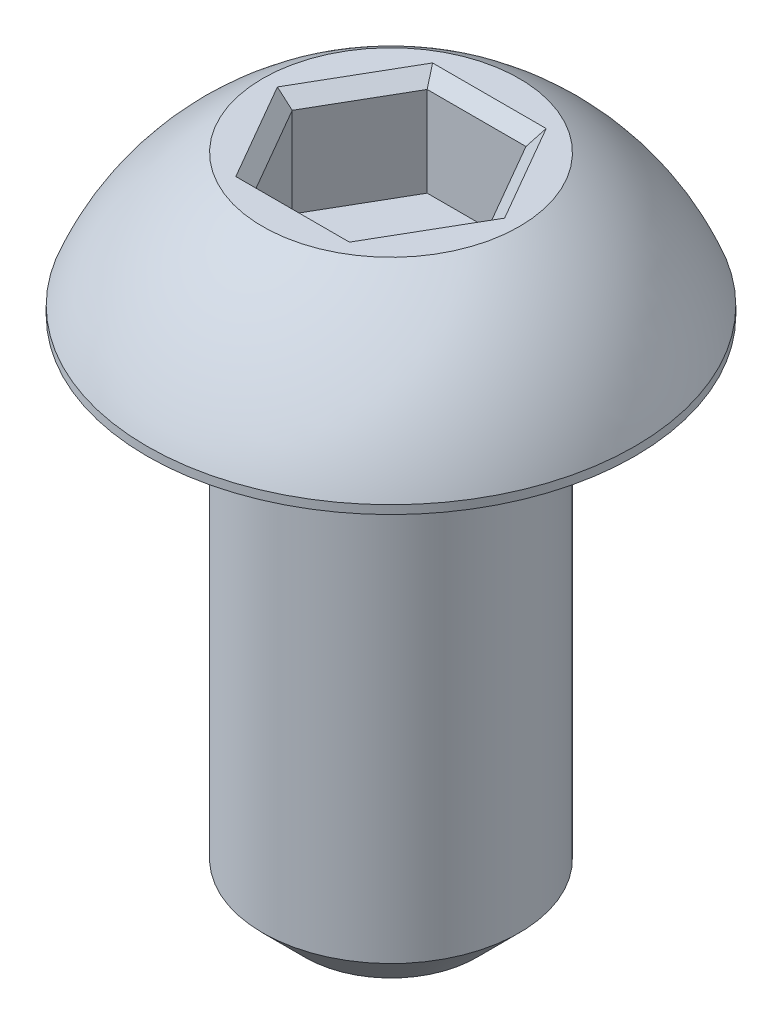
ISO-10303-21;
HEADER;
FILE_DESCRIPTION(('STEP AP214'),'2;1');
FILE_NAME('part.step','',(''),(''),'','','');
FILE_SCHEMA(('AUTOMOTIVE_DESIGN { 1 0 10303 214 1 1 1 1 }'));
ENDSEC;
DATA;
#1=APPLICATION_CONTEXT('core data for automotive mechanical design processes');
#2=APPLICATION_PROTOCOL_DEFINITION('international standard','automotive_design',2000,#1);
#3=PRODUCT_CONTEXT('',#1,'mechanical');
#4=PRODUCT('Part','Part','',(#3));
#5=PRODUCT_RELATED_PRODUCT_CATEGORY('part','',(#4));
#6=PRODUCT_DEFINITION_FORMATION('','',#4);
#7=PRODUCT_DEFINITION_CONTEXT('part definition',#1,'design');
#8=PRODUCT_DEFINITION('design','',#6,#7);
#9=PRODUCT_DEFINITION_SHAPE('','',#8);
#10=(LENGTH_UNIT() NAMED_UNIT(*) SI_UNIT(.MILLI.,.METRE.));
#11=(NAMED_UNIT(*) PLANE_ANGLE_UNIT() SI_UNIT($,.RADIAN.));
#12=(NAMED_UNIT(*) SI_UNIT($,.STERADIAN.) SOLID_ANGLE_UNIT());
#13=UNCERTAINTY_MEASURE_WITH_UNIT(LENGTH_MEASURE(1.E-05),#10,'distance_accuracy_value','');
#14=(GEOMETRIC_REPRESENTATION_CONTEXT(3) GLOBAL_UNCERTAINTY_ASSIGNED_CONTEXT((#13)) GLOBAL_UNIT_ASSIGNED_CONTEXT((#10,
#11,#12)) REPRESENTATION_CONTEXT('',''));
#15=CARTESIAN_POINT('',(0.,0.,0.));
#16=DIRECTION('',(0.,0.,1.));
#17=DIRECTION('',(1.,0.,0.));
#18=AXIS2_PLACEMENT_3D('',#15,#16,#17);
#19=CARTESIAN_POINT('',(0.,1.65,0.));
#20=DIRECTION('',(0.,-1.,0.));
#21=DIRECTION('',(0.,0.,-1.));
#22=AXIS2_PLACEMENT_3D('',#19,#20,#21);
#23=PLANE('',#22);
#24=DIRECTION('',(-0.5,0.,-0.866025403784439));
#25=VECTOR('',#24,1.);
#26=CARTESIAN_POINT('',(-0.995929214352105,1.65,0.575000000000002));
#27=LINE('',#26,#25);
#28=CARTESIAN_POINT('',(-0.663952809568065,1.65,1.15000000000001));
#29=VERTEX_POINT('',#28);
#30=CARTESIAN_POINT('',(-1.32790561913613,1.65,0.));
#31=VERTEX_POINT('',#30);
#32=EDGE_CURVE('E180',#29,#31,#27,.T.);
#33=ORIENTED_EDGE('',*,*,#32,.T.);
#34=DIRECTION('',(0.5,0.,-0.866025403784439));
#35=VECTOR('',#34,1.);
#36=CARTESIAN_POINT('',(-0.995929214352095,1.65,-0.574999999999996));
#37=LINE('',#36,#35);
#38=CARTESIAN_POINT('',(-0.663952809568065,1.65,-1.14999999999999));
#39=VERTEX_POINT('',#38);
#40=EDGE_CURVE('E182',#31,#39,#37,.T.);
#41=ORIENTED_EDGE('',*,*,#40,.T.);
#42=DIRECTION('',(1.,0.,0.));
#43=VECTOR('',#42,1.);
#44=CARTESIAN_POINT('',(0.,1.65,-1.14999999999999));
#45=LINE('',#44,#43);
#46=CARTESIAN_POINT('',(0.663952809568073,1.65,-1.14999999999999));
#47=VERTEX_POINT('',#46);
#48=EDGE_CURVE('E172',#39,#47,#45,.T.);
#49=ORIENTED_EDGE('',*,*,#48,.T.);
#50=DIRECTION('',(0.5,0.,0.866025403784439));
#51=VECTOR('',#50,1.);
#52=CARTESIAN_POINT('',(0.995929214352102,1.65,-0.574999999999998));
#53=LINE('',#52,#51);
#54=CARTESIAN_POINT('',(1.32790561913614,1.65,0.));
#55=VERTEX_POINT('',#54);
#56=EDGE_CURVE('E174',#47,#55,#53,.T.);
#57=ORIENTED_EDGE('',*,*,#56,.T.);
#58=DIRECTION('',(-0.5,0.,0.866025403784439));
#59=VECTOR('',#58,1.);
#60=CARTESIAN_POINT('',(0.995929214352113,1.65,0.575000000000003));
#61=LINE('',#60,#59);
#62=CARTESIAN_POINT('',(0.663952809568073,1.65,1.15000000000001));
#63=VERTEX_POINT('',#62);
#64=EDGE_CURVE('E176',#55,#63,#61,.T.);
#65=ORIENTED_EDGE('',*,*,#64,.T.);
#66=DIRECTION('',(-1.,0.,0.));
#67=VECTOR('',#66,1.);
#68=CARTESIAN_POINT('',(0.,1.65,1.15000000000001));
#69=LINE('',#68,#67);
#70=EDGE_CURVE('E178',#63,#29,#69,.T.);
#71=ORIENTED_EDGE('',*,*,#70,.T.);
#72=EDGE_LOOP('',(#33,#41,#49,#57,#65,#71));
#73=FACE_BOUND('',#72,.T.);
#74=CARTESIAN_POINT('',(0.,1.65,0.));
#75=DIRECTION('',(0.,1.,0.));
#76=DIRECTION('',(0.,0.,1.));
#77=AXIS2_PLACEMENT_3D('',#74,#75,#76);
#78=CIRCLE('',#77,1.5);
#79=CARTESIAN_POINT('',(1.5,1.65,0.));
#80=VERTEX_POINT('',#79);
#81=EDGE_CURVE('E168',#80,#80,#78,.T.);
#82=ORIENTED_EDGE('',*,*,#81,.T.);
#83=EDGE_LOOP('',(#82));
#84=FACE_BOUND('',#83,.T.);
#85=ADVANCED_FACE('F35',(#73,#84),#23,.F.);
#86=CARTESIAN_POINT('',(0.,-1.01935483870968,0.));
#87=DIRECTION('',(0.,1.,0.));
#88=DIRECTION('',(1.,0.,0.));
#89=AXIS2_PLACEMENT_3D('',#86,#87,#88);
#90=SPHERICAL_SURFACE('',#89,3.06193652039731);
#91=CARTESIAN_POINT('',(0.,0.1,0.));
#92=DIRECTION('',(0.,1.,0.));
#93=DIRECTION('',(0.,0.,1.));
#94=AXIS2_PLACEMENT_3D('',#91,#92,#93);
#95=CIRCLE('',#94,2.85);
#96=CARTESIAN_POINT('',(2.85,0.1,0.));
#97=VERTEX_POINT('',#96);
#98=EDGE_CURVE('E165',#97,#97,#95,.T.);
#99=CARTESIAN_POINT('',(1.5,1.65,0.));
#100=CARTESIAN_POINT('',(1.51903561196716,1.639303295306,0.));
#101=CARTESIAN_POINT('',(1.53795676556563,1.62840290684862,0.));
#102=CARTESIAN_POINT('',(1.57556158222851,1.6061998963006,0.));
#103=CARTESIAN_POINT('',(1.59424524529291,1.59489727420996,0.));
#104=CARTESIAN_POINT('',(1.63136650709099,1.57189493028889,0.));
#105=CARTESIAN_POINT('',(1.64980410582466,1.56019520845846,0.));
#106=CARTESIAN_POINT('',(1.68642480690278,1.53640403001542,0.));
#107=CARTESIAN_POINT('',(1.70460790924724,1.52431257340281,0.));
#108=CARTESIAN_POINT('',(1.7407112941585,1.49974345641876,0.));
#109=CARTESIAN_POINT('',(1.7586315767253,1.48726579604732,0.));
#110=CARTESIAN_POINT('',(1.79420112106677,1.46192998286172,0.));
#111=CARTESIAN_POINT('',(1.81185038284143,1.44907183004756,0.));
#112=CARTESIAN_POINT('',(1.84686980806014,1.42298091648115,0.));
#113=CARTESIAN_POINT('',(1.86423997150418,1.40974815572889,0.));
#114=CARTESIAN_POINT('',(1.89869325040636,1.38291408248949,0.));
#115=CARTESIAN_POINT('',(1.9157763658645,1.36931277000235,0.));
#116=CARTESIAN_POINT('',(1.9496477304707,1.34174781810087,0.));
#117=CARTESIAN_POINT('',(1.96643597961876,1.32778417868653,0.));
#118=CARTESIAN_POINT('',(1.99970992824093,1.29950096358037,0.));
#119=CARTESIAN_POINT('',(2.01619562771503,1.28518138788854,0.));
#120=CARTESIAN_POINT('',(2.04885693208838,1.2561928537712,0.));
#121=CARTESIAN_POINT('',(2.06503253698763,1.24152389534568,0.));
#122=CARTESIAN_POINT('',(2.09706624923009,1.21184330920572,0.));
#123=CARTESIAN_POINT('',(2.1129243565733,1.19683168149128,0.));
#124=CARTESIAN_POINT('',(2.14431581602928,1.16647262704509,0.));
#125=CARTESIAN_POINT('',(2.15984916814205,1.15112520031333,0.));
#126=CARTESIAN_POINT('',(2.19058400809134,1.12010157178707,0.));
#127=CARTESIAN_POINT('',(2.20578549592787,1.10442536999258,0.));
#128=CARTESIAN_POINT('',(2.23584965016101,1.07275136576372,0.));
#129=CARTESIAN_POINT('',(2.25071231655761,1.05675356332935,0.));
#130=CARTESIAN_POINT('',(2.28009202581336,1.02444367942842,0.));
#131=CARTESIAN_POINT('',(2.29460906867251,1.00813159796187,0.));
#132=CARTESIAN_POINT('',(2.32329088693502,0.975200621438238,0.));
#133=CARTESIAN_POINT('',(2.33745566233839,0.958581726381168,0.));
#134=CARTESIAN_POINT('',(2.36542646299095,0.925044728535524,0.));
#135=CARTESIAN_POINT('',(2.37923248824013,0.908126625746949,0.));
#136=CARTESIAN_POINT('',(2.40647947007269,0.873998955233716,0.));
#137=CARTESIAN_POINT('',(2.41992042665607,0.856789387509057,0.));
#138=CARTESIAN_POINT('',(2.44643111972394,0.822086663311891,0.));
#139=CARTESIAN_POINT('',(2.45950085620844,0.804593506839383,0.));
#140=CARTESIAN_POINT('',(2.4852631275393,0.769331611122919,0.));
#141=CARTESIAN_POINT('',(2.49795566238565,0.751562871878962,0.));
#142=CARTESIAN_POINT('',(2.52295772153242,0.715757942720172,0.));
#143=CARTESIAN_POINT('',(2.53526724583283,0.697721752805339,0.));
#144=CARTESIAN_POINT('',(2.55949765026941,0.661390176807579,0.));
#145=CARTESIAN_POINT('',(2.57141853040558,0.643094790724652,0.));
#146=CARTESIAN_POINT('',(2.59486619076497,0.606253195518658,0.));
#147=CARTESIAN_POINT('',(2.6063929709882,0.58770698639559,0.));
#148=CARTESIAN_POINT('',(2.62904715613284,0.550372233027588,0.));
#149=CARTESIAN_POINT('',(2.64017456105425,0.531583688782654,0.));
#150=CARTESIAN_POINT('',(2.6620249030054,0.493772864005264,0.));
#151=CARTESIAN_POINT('',(2.67274784003514,0.474750583472809,0.));
#152=CARTESIAN_POINT('',(2.6937843386502,0.43648099189676,0.));
#153=CARTESIAN_POINT('',(2.70409790023551,0.417233680853167,0.));
#154=CARTESIAN_POINT('',(2.72431092803757,0.37852283713324,0.));
#155=CARTESIAN_POINT('',(2.73421039425431,0.359059304456906,0.));
#156=CARTESIAN_POINT('',(2.75359069989448,0.319924924881905,0.));
#157=CARTESIAN_POINT('',(2.76307153931791,0.300254077983239,0.));
#158=CARTESIAN_POINT('',(2.78161025533183,0.260714073839118,0.));
#159=CARTESIAN_POINT('',(2.79066813192231,0.240844916593663,0.));
#160=CARTESIAN_POINT('',(2.80835676564226,0.200917380475518,0.));
#161=CARTESIAN_POINT('',(2.81698752277173,0.180859001602827,0.));
#162=CARTESIAN_POINT('',(2.83381800927563,0.140562219626024,0.));
#163=CARTESIAN_POINT('',(2.84201773865007,0.120323816521913,0.));
#164=CARTESIAN_POINT('',(2.85,0.1,0.));
#165=B_SPLINE_CURVE_WITH_KNOTS('',3,(#99,#100,#101,#102,#103,#104,#105,#106,#107,#108,#109,#110,
#111,#112,#113,#114,#115,#116,#117,#118,#119,#120,#121,#122,#123,#124,#125,#126,#127,#128,#129,
#130,#131,#132,#133,#134,#135,#136,#137,#138,#139,#140,#141,#142,#143,#144,#145,#146,#147,#148,
#149,#150,#151,#152,#153,#154,#155,#156,#157,#158,#159,#160,#161,#162,#163,#164),.UNSPECIFIED.,
.F.,.F.,(4,2,2,2,2,2,2,2,2,2,2,2,2,2,2,2,2,2,2,2,2,2,2,2,2,2,2,2,2,2,2,2,4),(0.,
0.0655042148297505,0.131008429659501,0.196512644489251,0.262016859319002,0.327521074148752,
0.393025288978502,0.458529503808253,0.524033718638003,0.589537933467754,0.655042148297504,
0.720546363127254,0.786050577957005,0.851554792786755,0.917059007616505,0.982563222446256,
1.04806743727601,1.11357165210576,1.17907586693551,1.24458008176526,1.31008429659501,
1.37558851142476,1.44109272625451,1.50659694108426,1.57210115591401,1.63760537074376,
1.70310958557351,1.76861380040326,1.83411801523301,1.89962223006276,1.96512644489251,
2.03063065972226,2.09613487455201),.UNSPECIFIED.);
#166=EDGE_CURVE('BSEAM236',#80,#97,#165,.T.);
#167=ORIENTED_EDGE('',*,*,#81,.F.);
#168=ORIENTED_EDGE('',*,*,#98,.T.);
#169=ORIENTED_EDGE('',*,*,#166,.T.);
#170=ORIENTED_EDGE('',*,*,#166,.F.);
#171=EDGE_LOOP('',(#167,#169,#168,#170));
#172=FACE_BOUND('',#171,.T.);
#173=ADVANCED_FACE('F236',(#172),#90,.T.);
#174=CARTESIAN_POINT('',(0.,6.97297297297297,0.));
#175=DIRECTION('',(0.,1.,0.));
#176=DIRECTION('',(0.,0.,1.));
#177=AXIS2_PLACEMENT_3D('',#174,#175,#176);
#178=CYLINDRICAL_SURFACE('',#177,2.85);
#179=ORIENTED_EDGE('',*,*,#98,.F.);
#180=EDGE_LOOP('',(#179));
#181=FACE_BOUND('',#180,.T.);
#182=CARTESIAN_POINT('',(0.,0.,0.));
#183=DIRECTION('',(0.,1.,0.));
#184=DIRECTION('',(0.,0.,1.));
#185=AXIS2_PLACEMENT_3D('',#182,#183,#184);
#186=CIRCLE('',#185,2.85);
#187=CARTESIAN_POINT('',(0.,0.,2.85));
#188=VERTEX_POINT('',#187);
#189=EDGE_CURVE('E162',#188,#188,#186,.T.);
#190=ORIENTED_EDGE('',*,*,#189,.T.);
#191=EDGE_LOOP('',(#190));
#192=FACE_BOUND('',#191,.T.);
#193=ADVANCED_FACE('F242',(#181,#192),#178,.T.);
#194=CARTESIAN_POINT('',(2.85,0.,0.));
#195=DIRECTION('',(0.,1.,0.));
#196=DIRECTION('',(0.,0.,1.));
#197=AXIS2_PLACEMENT_3D('',#194,#195,#196);
#198=PLANE('',#197);
#199=ORIENTED_EDGE('',*,*,#189,.F.);
#200=EDGE_LOOP('',(#199));
#201=FACE_BOUND('',#200,.T.);
#202=CARTESIAN_POINT('',(0.,0.,0.));
#203=DIRECTION('',(0.,1.,0.));
#204=DIRECTION('',(0.,0.,1.));
#205=AXIS2_PLACEMENT_3D('',#202,#203,#204);
#206=CIRCLE('',#205,1.5);
#207=CARTESIAN_POINT('',(0.,0.,1.5));
#208=VERTEX_POINT('',#207);
#209=EDGE_CURVE('E159',#208,#208,#206,.T.);
#210=ORIENTED_EDGE('',*,*,#209,.T.);
#211=EDGE_LOOP('',(#210));
#212=FACE_BOUND('',#211,.T.);
#213=ADVANCED_FACE('F372',(#201,#212),#198,.F.);
#214=CARTESIAN_POINT('',(0.,6.97297297297297,0.));
#215=DIRECTION('',(0.,1.,0.));
#216=DIRECTION('',(0.,0.,1.));
#217=AXIS2_PLACEMENT_3D('',#214,#215,#216);
#218=CYLINDRICAL_SURFACE('',#217,1.5);
#219=ORIENTED_EDGE('',*,*,#209,.F.);
#220=EDGE_LOOP('',(#219));
#221=FACE_BOUND('',#220,.T.);
#222=CARTESIAN_POINT('',(0.,-5.5,0.));
#223=DIRECTION('',(0.,1.,0.));
#224=DIRECTION('',(0.,0.,1.));
#225=AXIS2_PLACEMENT_3D('',#222,#223,#224);
#226=CIRCLE('',#225,1.5);
#227=CARTESIAN_POINT('',(0.,-5.5,1.5));
#228=VERTEX_POINT('',#227);
#229=EDGE_CURVE('E156',#228,#228,#226,.T.);
#230=ORIENTED_EDGE('',*,*,#229,.T.);
#231=EDGE_LOOP('',(#230));
#232=FACE_BOUND('',#231,.T.);
#233=ADVANCED_FACE('F363',(#221,#232),#218,.T.);
#234=CARTESIAN_POINT('',(0.,-6.,0.));
#235=DIRECTION('',(0.,1.,0.));
#236=DIRECTION('',(0.,0.,1.));
#237=AXIS2_PLACEMENT_3D('',#234,#235,#236);
#238=CONICAL_SURFACE('',#237,1.,0.785398163397448);
#239=ORIENTED_EDGE('',*,*,#229,.F.);
#240=EDGE_LOOP('',(#239));
#241=FACE_BOUND('',#240,.T.);
#242=CARTESIAN_POINT('',(0.,-6.,0.));
#243=DIRECTION('',(0.,1.,0.));
#244=DIRECTION('',(0.,0.,1.));
#245=AXIS2_PLACEMENT_3D('',#242,#243,#244);
#246=CIRCLE('',#245,1.);
#247=CARTESIAN_POINT('',(0.,-6.,1.));
#248=VERTEX_POINT('',#247);
#249=EDGE_CURVE('E146',#248,#248,#246,.T.);
#250=ORIENTED_EDGE('',*,*,#249,.T.);
#251=EDGE_LOOP('',(#250));
#252=FACE_BOUND('',#251,.T.);
#253=ADVANCED_FACE('F358',(#241,#252),#238,.T.);
#254=CARTESIAN_POINT('',(1.,-6.,0.));
#255=DIRECTION('',(0.,1.,0.));
#256=DIRECTION('',(0.,0.,1.));
#257=AXIS2_PLACEMENT_3D('',#254,#255,#256);
#258=PLANE('',#257);
#259=ORIENTED_EDGE('',*,*,#249,.F.);
#260=EDGE_LOOP('',(#259));
#261=FACE_BOUND('',#260,.T.);
#262=ADVANCED_FACE('F333',(#261),#258,.F.);
#263=CARTESIAN_POINT('',(-0.577350269189622,0.450000000000001,-0.999999999999988));
#264=DIRECTION('',(-0.866025403784439,0.,-0.5));
#265=DIRECTION('',(-0.5,0.,0.866025403784439));
#266=AXIS2_PLACEMENT_3D('',#263,#264,#265);
#267=PLANE('',#266);
#268=DIRECTION('',(0.,1.,0.));
#269=VECTOR('',#268,1.);
#270=CARTESIAN_POINT('',(-0.577350269189622,0.450000000000001,-0.999999999999988));
#271=LINE('',#270,#269);
#272=CARTESIAN_POINT('',(-0.577350269189622,0.450000000000001,-0.999999999999988));
#273=VERTEX_POINT('',#272);
#274=CARTESIAN_POINT('',(-0.577350269189622,1.5,-0.999999999999988));
#275=VERTEX_POINT('',#274);
#276=EDGE_CURVE('E144',#273,#275,#271,.T.);
#277=ORIENTED_EDGE('',*,*,#276,.T.);
#278=DIRECTION('',(-0.5,0.,0.866025403784439));
#279=VECTOR('',#278,1.);
#280=CARTESIAN_POINT('',(-0.577350269189622,1.5,-0.999999999999988));
#281=LINE('',#280,#279);
#282=CARTESIAN_POINT('',(-1.15470053837925,1.5,0.));
#283=VERTEX_POINT('',#282);
#284=EDGE_CURVE('E116',#275,#283,#281,.T.);
#285=ORIENTED_EDGE('',*,*,#284,.T.);
#286=DIRECTION('',(0.,1.,0.));
#287=VECTOR('',#286,1.);
#288=CARTESIAN_POINT('',(-1.15470053837925,0.450000000000001,0.));
#289=LINE('',#288,#287);
#290=CARTESIAN_POINT('',(-1.15470053837925,0.450000000000001,0.));
#291=VERTEX_POINT('',#290);
#292=EDGE_CURVE('E108',#291,#283,#289,.T.);
#293=ORIENTED_EDGE('',*,*,#292,.F.);
#294=DIRECTION('',(-0.5,0.,0.866025403784439));
#295=VECTOR('',#294,1.);
#296=CARTESIAN_POINT('',(-0.577350269189622,0.450000000000001,-0.999999999999988));
#297=LINE('',#296,#295);
#298=EDGE_CURVE('E113',#273,#291,#297,.T.);
#299=ORIENTED_EDGE('',*,*,#298,.F.);
#300=EDGE_LOOP('',(#277,#285,#293,#299));
#301=FACE_BOUND('',#300,.T.);
#302=ADVANCED_FACE('F111',(#301),#267,.F.);
#303=CARTESIAN_POINT('',(0.57735026918963,0.450000000000001,-0.999999999999988));
#304=DIRECTION('',(0.,0.,-1.));
#305=DIRECTION('',(-1.,0.,0.));
#306=AXIS2_PLACEMENT_3D('',#303,#304,#305);
#307=PLANE('',#306);
#308=DIRECTION('',(0.,1.,0.));
#309=VECTOR('',#308,1.);
#310=CARTESIAN_POINT('',(0.57735026918963,0.450000000000001,-0.999999999999988));
#311=LINE('',#310,#309);
#312=CARTESIAN_POINT('',(0.57735026918963,0.450000000000001,-0.999999999999988));
#313=VERTEX_POINT('',#312);
#314=CARTESIAN_POINT('',(0.57735026918963,1.5,-0.999999999999988));
#315=VERTEX_POINT('',#314);
#316=EDGE_CURVE('E147',#313,#315,#311,.T.);
#317=ORIENTED_EDGE('',*,*,#316,.T.);
#318=DIRECTION('',(-1.,0.,0.));
#319=VECTOR('',#318,1.);
#320=CARTESIAN_POINT('',(0.57735026918963,1.5,-0.999999999999988));
#321=LINE('',#320,#319);
#322=EDGE_CURVE('E11',#315,#275,#321,.T.);
#323=ORIENTED_EDGE('',*,*,#322,.T.);
#324=ORIENTED_EDGE('',*,*,#276,.F.);
#325=DIRECTION('',(-1.,0.,0.));
#326=VECTOR('',#325,1.);
#327=CARTESIAN_POINT('',(0.57735026918963,0.450000000000001,-0.999999999999988));
#328=LINE('',#327,#326);
#329=EDGE_CURVE('E119',#313,#273,#328,.T.);
#330=ORIENTED_EDGE('',*,*,#329,.F.);
#331=EDGE_LOOP('',(#317,#323,#324,#330));
#332=FACE_BOUND('',#331,.T.);
#333=ADVANCED_FACE('F220',(#332),#307,.F.);
#334=CARTESIAN_POINT('',(1.15470053837926,0.450000000000001,0.));
#335=DIRECTION('',(0.866025403784439,0.,-0.5));
#336=DIRECTION('',(-0.5,0.,-0.866025403784439));
#337=AXIS2_PLACEMENT_3D('',#334,#335,#336);
#338=PLANE('',#337);
#339=DIRECTION('',(0.,1.,0.));
#340=VECTOR('',#339,1.);
#341=CARTESIAN_POINT('',(1.15470053837926,0.450000000000001,0.));
#342=LINE('',#341,#340);
#343=CARTESIAN_POINT('',(1.15470053837926,0.450000000000001,0.));
#344=VERTEX_POINT('',#343);
#345=CARTESIAN_POINT('',(1.15470053837926,1.5,0.));
#346=VERTEX_POINT('',#345);
#347=EDGE_CURVE('E149',#344,#346,#342,.T.);
#348=ORIENTED_EDGE('',*,*,#347,.T.);
#349=DIRECTION('',(-0.5,0.,-0.866025403784439));
#350=VECTOR('',#349,1.);
#351=CARTESIAN_POINT('',(1.15470053837926,1.5,0.));
#352=LINE('',#351,#350);
#353=EDGE_CURVE('E44',#346,#315,#352,.T.);
#354=ORIENTED_EDGE('',*,*,#353,.T.);
#355=ORIENTED_EDGE('',*,*,#316,.F.);
#356=DIRECTION('',(-0.5,0.,-0.866025403784439));
#357=VECTOR('',#356,1.);
#358=CARTESIAN_POINT('',(1.15470053837926,0.450000000000001,0.));
#359=LINE('',#358,#357);
#360=EDGE_CURVE('E141',#344,#313,#359,.T.);
#361=ORIENTED_EDGE('',*,*,#360,.F.);
#362=EDGE_LOOP('',(#348,#354,#355,#361));
#363=FACE_BOUND('',#362,.T.);
#364=ADVANCED_FACE('F222',(#363),#338,.F.);
#365=CARTESIAN_POINT('',(0.57735026918963,0.450000000000001,1.00000000000001));
#366=DIRECTION('',(0.866025403784439,0.,0.5));
#367=DIRECTION('',(0.5,0.,-0.866025403784439));
#368=AXIS2_PLACEMENT_3D('',#365,#366,#367);
#369=PLANE('',#368);
#370=DIRECTION('',(0.,1.,0.));
#371=VECTOR('',#370,1.);
#372=CARTESIAN_POINT('',(0.57735026918963,0.450000000000001,1.00000000000001));
#373=LINE('',#372,#371);
#374=CARTESIAN_POINT('',(0.57735026918963,0.450000000000001,1.00000000000001));
#375=VERTEX_POINT('',#374);
#376=CARTESIAN_POINT('',(0.57735026918963,1.5,1.00000000000001));
#377=VERTEX_POINT('',#376);
#378=EDGE_CURVE('E151',#375,#377,#373,.T.);
#379=ORIENTED_EDGE('',*,*,#378,.T.);
#380=DIRECTION('',(0.5,0.,-0.866025403784439));
#381=VECTOR('',#380,1.);
#382=CARTESIAN_POINT('',(0.57735026918963,1.5,1.00000000000001));
#383=LINE('',#382,#381);
#384=EDGE_CURVE('E59',#377,#346,#383,.T.);
#385=ORIENTED_EDGE('',*,*,#384,.T.);
#386=ORIENTED_EDGE('',*,*,#347,.F.);
#387=DIRECTION('',(0.5,0.,-0.866025403784439));
#388=VECTOR('',#387,1.);
#389=CARTESIAN_POINT('',(0.57735026918963,0.450000000000001,1.00000000000001));
#390=LINE('',#389,#388);
#391=EDGE_CURVE('E138',#375,#344,#390,.T.);
#392=ORIENTED_EDGE('',*,*,#391,.F.);
#393=EDGE_LOOP('',(#379,#385,#386,#392));
#394=FACE_BOUND('',#393,.T.);
#395=ADVANCED_FACE('F224',(#394),#369,.F.);
#396=CARTESIAN_POINT('',(-0.577350269189622,0.450000000000001,1.00000000000001));
#397=DIRECTION('',(0.,0.,1.));
#398=DIRECTION('',(1.,0.,0.));
#399=AXIS2_PLACEMENT_3D('',#396,#397,#398);
#400=PLANE('',#399);
#401=DIRECTION('',(0.,1.,0.));
#402=VECTOR('',#401,1.);
#403=CARTESIAN_POINT('',(-0.577350269189622,0.450000000000001,1.00000000000001));
#404=LINE('',#403,#402);
#405=CARTESIAN_POINT('',(-0.577350269189622,0.450000000000001,1.00000000000001));
#406=VERTEX_POINT('',#405);
#407=CARTESIAN_POINT('',(-0.577350269189622,1.5,1.00000000000001));
#408=VERTEX_POINT('',#407);
#409=EDGE_CURVE('E118',#406,#408,#404,.T.);
#410=ORIENTED_EDGE('',*,*,#409,.T.);
#411=DIRECTION('',(1.,0.,0.));
#412=VECTOR('',#411,1.);
#413=CARTESIAN_POINT('',(-0.577350269189622,1.5,1.00000000000001));
#414=LINE('',#413,#412);
#415=EDGE_CURVE('E187',#408,#377,#414,.T.);
#416=ORIENTED_EDGE('',*,*,#415,.T.);
#417=ORIENTED_EDGE('',*,*,#378,.F.);
#418=DIRECTION('',(1.,0.,0.));
#419=VECTOR('',#418,1.);
#420=CARTESIAN_POINT('',(-0.577350269189622,0.450000000000001,1.00000000000001));
#421=LINE('',#420,#419);
#422=EDGE_CURVE('E128',#406,#375,#421,.T.);
#423=ORIENTED_EDGE('',*,*,#422,.F.);
#424=EDGE_LOOP('',(#410,#416,#417,#423));
#425=FACE_BOUND('',#424,.T.);
#426=ADVANCED_FACE('F226',(#425),#400,.F.);
#427=CARTESIAN_POINT('',(-1.15470053837925,0.450000000000001,0.));
#428=DIRECTION('',(-0.866025403784439,0.,0.5));
#429=DIRECTION('',(0.5,0.,0.866025403784439));
#430=AXIS2_PLACEMENT_3D('',#427,#428,#429);
#431=PLANE('',#430);
#432=ORIENTED_EDGE('',*,*,#292,.T.);
#433=DIRECTION('',(0.5,0.,0.866025403784439));
#434=VECTOR('',#433,1.);
#435=CARTESIAN_POINT('',(-1.15470053837925,1.5,0.));
#436=LINE('',#435,#434);
#437=EDGE_CURVE('E185',#283,#408,#436,.T.);
#438=ORIENTED_EDGE('',*,*,#437,.T.);
#439=ORIENTED_EDGE('',*,*,#409,.F.);
#440=DIRECTION('',(0.5,0.,0.866025403784439));
#441=VECTOR('',#440,1.);
#442=CARTESIAN_POINT('',(-1.15470053837925,0.450000000000001,0.));
#443=LINE('',#442,#441);
#444=EDGE_CURVE('E122',#291,#406,#443,.T.);
#445=ORIENTED_EDGE('',*,*,#444,.F.);
#446=EDGE_LOOP('',(#432,#438,#439,#445));
#447=FACE_BOUND('',#446,.T.);
#448=ADVANCED_FACE('F123',(#447),#431,.F.);
#449=CARTESIAN_POINT('',(0.,0.450000000000001,0.));
#450=DIRECTION('',(0.,1.,0.));
#451=DIRECTION('',(0.,0.,1.));
#452=AXIS2_PLACEMENT_3D('',#449,#450,#451);
#453=PLANE('',#452);
#454=ORIENTED_EDGE('',*,*,#298,.T.);
#455=ORIENTED_EDGE('',*,*,#444,.T.);
#456=ORIENTED_EDGE('',*,*,#422,.T.);
#457=ORIENTED_EDGE('',*,*,#391,.T.);
#458=ORIENTED_EDGE('',*,*,#360,.T.);
#459=ORIENTED_EDGE('',*,*,#329,.T.);
#460=EDGE_LOOP('',(#454,#455,#456,#457,#458,#459));
#461=FACE_BOUND('',#460,.T.);
#462=ADVANCED_FACE('F130',(#461),#453,.T.);
#463=CARTESIAN_POINT('',(0.57735026918963,1.5,1.00000000000001));
#464=DIRECTION('',(0.612372435695795,-0.707106781186547,0.353553390593274));
#465=DIRECTION('',(0.5,0.,-0.866025403784439));
#466=AXIS2_PLACEMENT_3D('',#463,#464,#465);
#467=PLANE('',#466);
#468=DIRECTION('',(0.377964473009227,0.654653670707977,0.654653670707977));
#469=VECTOR('',#468,1.);
#470=CARTESIAN_POINT('',(0.412393049421166,1.21428571428572,0.714285714285727));
#471=LINE('',#470,#469);
#472=EDGE_CURVE('E135',#63,#377,#471,.F.);
#473=ORIENTED_EDGE('',*,*,#472,.F.);
#474=ORIENTED_EDGE('',*,*,#64,.F.);
#475=DIRECTION('',(0.755928946018454,0.654653670707977,0.));
#476=VECTOR('',#475,1.);
#477=CARTESIAN_POINT('',(0.824786098842325,1.21428571428571,0.));
#478=LINE('',#477,#476);
#479=EDGE_CURVE('E39',#346,#55,#478,.T.);
#480=ORIENTED_EDGE('',*,*,#479,.F.);
#481=ORIENTED_EDGE('',*,*,#384,.F.);
#482=EDGE_LOOP('',(#473,#474,#480,#481));
#483=FACE_BOUND('',#482,.T.);
#484=ADVANCED_FACE('F37',(#483),#467,.F.);
#485=CARTESIAN_POINT('',(1.15470053837926,1.5,0.));
#486=DIRECTION('',(0.612372435695794,-0.707106781186548,-0.353553390593273));
#487=DIRECTION('',(-0.5,0.,-0.866025403784439));
#488=AXIS2_PLACEMENT_3D('',#485,#486,#487);
#489=PLANE('',#488);
#490=ORIENTED_EDGE('',*,*,#479,.T.);
#491=ORIENTED_EDGE('',*,*,#56,.F.);
#492=DIRECTION('',(0.377964473009229,0.654653670707977,-0.654653670707977));
#493=VECTOR('',#492,1.);
#494=CARTESIAN_POINT('',(0.412393049421165,1.21428571428572,-0.714285714285703));
#495=LINE('',#494,#493);
#496=EDGE_CURVE('E198',#315,#47,#495,.T.);
#497=ORIENTED_EDGE('',*,*,#496,.F.);
#498=ORIENTED_EDGE('',*,*,#353,.F.);
#499=EDGE_LOOP('',(#490,#491,#497,#498));
#500=FACE_BOUND('',#499,.T.);
#501=ADVANCED_FACE('F213',(#500),#489,.F.);
#502=CARTESIAN_POINT('',(-0.577350269189622,1.5,1.00000000000001));
#503=DIRECTION('',(0.,-0.707106781186547,0.707106781186547));
#504=DIRECTION('',(1.,0.,0.));
#505=AXIS2_PLACEMENT_3D('',#502,#503,#504);
#506=PLANE('',#505);
#507=ORIENTED_EDGE('',*,*,#472,.T.);
#508=ORIENTED_EDGE('',*,*,#415,.F.);
#509=DIRECTION('',(-0.377964473009228,0.654653670707977,0.654653670707977));
#510=VECTOR('',#509,1.);
#511=CARTESIAN_POINT('',(-0.412393049421157,1.21428571428572,0.714285714285727));
#512=LINE('',#511,#510);
#513=EDGE_CURVE('E195',#29,#408,#512,.F.);
#514=ORIENTED_EDGE('',*,*,#513,.F.);
#515=ORIENTED_EDGE('',*,*,#70,.F.);
#516=EDGE_LOOP('',(#507,#508,#514,#515));
#517=FACE_BOUND('',#516,.T.);
#518=ADVANCED_FACE('F205',(#517),#506,.F.);
#519=CARTESIAN_POINT('',(0.57735026918963,1.5,-0.999999999999988));
#520=DIRECTION('',(0.,-0.707106781186547,-0.707106781186548));
#521=DIRECTION('',(-1.,0.,0.));
#522=AXIS2_PLACEMENT_3D('',#519,#520,#521);
#523=PLANE('',#522);
#524=ORIENTED_EDGE('',*,*,#496,.T.);
#525=ORIENTED_EDGE('',*,*,#48,.F.);
#526=DIRECTION('',(0.377964473009229,-0.654653670707977,0.654653670707976));
#527=VECTOR('',#526,1.);
#528=CARTESIAN_POINT('',(-0.577350269189622,1.5,-0.999999999999988));
#529=LINE('',#528,#527);
#530=EDGE_CURVE('E193',#275,#39,#529,.F.);
#531=ORIENTED_EDGE('',*,*,#530,.F.);
#532=ORIENTED_EDGE('',*,*,#322,.F.);
#533=EDGE_LOOP('',(#524,#525,#531,#532));
#534=FACE_BOUND('',#533,.T.);
#535=ADVANCED_FACE('F218',(#534),#523,.F.);
#536=CARTESIAN_POINT('',(-1.15470053837925,1.5,0.));
#537=DIRECTION('',(-0.612372435695794,-0.707106781186548,0.353553390593274));
#538=DIRECTION('',(0.5,0.,0.866025403784439));
#539=AXIS2_PLACEMENT_3D('',#536,#537,#538);
#540=PLANE('',#539);
#541=ORIENTED_EDGE('',*,*,#513,.T.);
#542=ORIENTED_EDGE('',*,*,#437,.F.);
#543=DIRECTION('',(-0.755928946018455,0.654653670707977,0.));
#544=VECTOR('',#543,1.);
#545=CARTESIAN_POINT('',(-0.824786098842319,1.21428571428572,0.));
#546=LINE('',#545,#544);
#547=EDGE_CURVE('E191',#31,#283,#546,.F.);
#548=ORIENTED_EDGE('',*,*,#547,.F.);
#549=ORIENTED_EDGE('',*,*,#32,.F.);
#550=EDGE_LOOP('',(#541,#542,#548,#549));
#551=FACE_BOUND('',#550,.T.);
#552=ADVANCED_FACE('F251',(#551),#540,.F.);
#553=CARTESIAN_POINT('',(-0.577350269189622,1.5,-0.999999999999988));
#554=DIRECTION('',(-0.612372435695794,-0.707106781186548,-0.353553390593273));
#555=DIRECTION('',(-0.5,0.,0.866025403784439));
#556=AXIS2_PLACEMENT_3D('',#553,#554,#555);
#557=PLANE('',#556);
#558=ORIENTED_EDGE('',*,*,#530,.T.);
#559=ORIENTED_EDGE('',*,*,#40,.F.);
#560=ORIENTED_EDGE('',*,*,#547,.T.);
#561=ORIENTED_EDGE('',*,*,#284,.F.);
#562=EDGE_LOOP('',(#558,#559,#560,#561));
#563=FACE_BOUND('',#562,.T.);
#564=ADVANCED_FACE('F248',(#563),#557,.F.);
#565=CLOSED_SHELL('',(#85,#173,#193,#213,#233,#253,#262,#302,#333,#364,#395,#426,#448,#462,#484,
#501,#518,#535,#552,#564));
#566=MANIFOLD_SOLID_BREP('B2',#565);
#567=ADVANCED_BREP_SHAPE_REPRESENTATION('',(#18,#566),#14);
#568=SHAPE_DEFINITION_REPRESENTATION(#9,#567);
ENDSEC;
END-ISO-10303-21;
